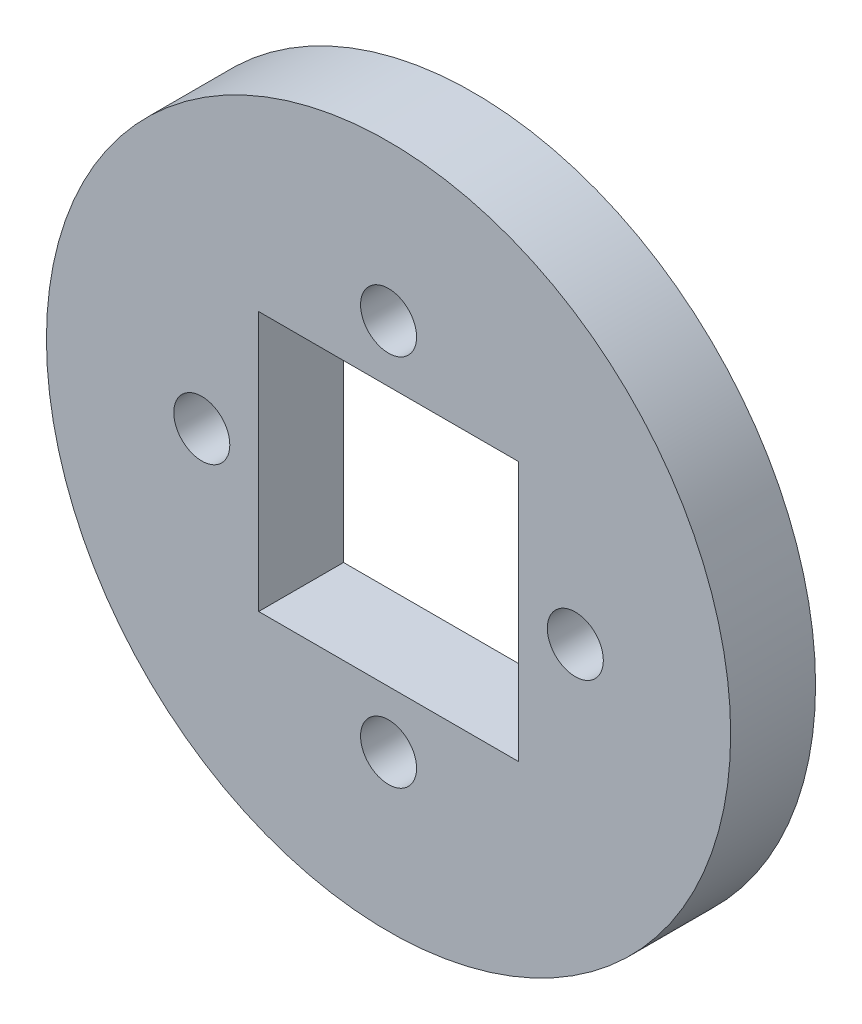
ISO-10303-21;
HEADER;
FILE_DESCRIPTION(('STEP AP214'),'2;1');
FILE_NAME('part.step','',(''),(''),'','','');
FILE_SCHEMA(('AUTOMOTIVE_DESIGN { 1 0 10303 214 1 1 1 1 }'));
ENDSEC;
DATA;
#1=APPLICATION_CONTEXT('core data for automotive mechanical design processes');
#2=APPLICATION_PROTOCOL_DEFINITION('international standard','automotive_design',2000,#1);
#3=PRODUCT_CONTEXT('',#1,'mechanical');
#4=PRODUCT('Part','Part','',(#3));
#5=PRODUCT_RELATED_PRODUCT_CATEGORY('part','',(#4));
#6=PRODUCT_DEFINITION_FORMATION('','',#4);
#7=PRODUCT_DEFINITION_CONTEXT('part definition',#1,'design');
#8=PRODUCT_DEFINITION('design','',#6,#7);
#9=PRODUCT_DEFINITION_SHAPE('','',#8);
#10=(LENGTH_UNIT() NAMED_UNIT(*) SI_UNIT(.MILLI.,.METRE.));
#11=(NAMED_UNIT(*) PLANE_ANGLE_UNIT() SI_UNIT($,.RADIAN.));
#12=(NAMED_UNIT(*) SI_UNIT($,.STERADIAN.) SOLID_ANGLE_UNIT());
#13=UNCERTAINTY_MEASURE_WITH_UNIT(LENGTH_MEASURE(1.E-05),#10,'distance_accuracy_value','');
#14=(GEOMETRIC_REPRESENTATION_CONTEXT(3) GLOBAL_UNCERTAINTY_ASSIGNED_CONTEXT((#13)) GLOBAL_UNIT_ASSIGNED_CONTEXT((#10,
#11,#12)) REPRESENTATION_CONTEXT('',''));
#15=CARTESIAN_POINT('',(0.,0.,0.));
#16=DIRECTION('',(0.,0.,1.));
#17=DIRECTION('',(1.,0.,0.));
#18=AXIS2_PLACEMENT_3D('',#15,#16,#17);
#19=CARTESIAN_POINT('',(2.28994472842277E-13,22.,10.));
#20=DIRECTION('',(0.,0.,-1.));
#21=DIRECTION('',(-1.,0.,0.));
#22=AXIS2_PLACEMENT_3D('',#19,#20,#21);
#23=CYLINDRICAL_SURFACE('',#22,1.64999999999999);
#24=CARTESIAN_POINT('',(2.28994472842277E-13,22.,0.));
#25=DIRECTION('',(0.,0.,1.));
#26=DIRECTION('',(1.,0.,0.));
#27=AXIS2_PLACEMENT_3D('',#24,#25,#26);
#28=CIRCLE('',#27,1.64999999999999);
#29=CARTESIAN_POINT('',(1.65000000000022,22.,0.));
#30=VERTEX_POINT('',#29);
#31=EDGE_CURVE('E108',#30,#30,#28,.T.);
#32=ORIENTED_EDGE('',*,*,#31,.F.);
#33=EDGE_LOOP('',(#32));
#34=FACE_BOUND('',#33,.T.);
#35=CARTESIAN_POINT('',(2.28994472842277E-13,22.,4.));
#36=DIRECTION('',(0.,0.,1.));
#37=DIRECTION('',(1.,0.,0.));
#38=AXIS2_PLACEMENT_3D('',#35,#36,#37);
#39=CIRCLE('',#38,1.64999999999999);
#40=CARTESIAN_POINT('',(1.65000000000022,22.,4.));
#41=VERTEX_POINT('',#40);
#42=EDGE_CURVE('E41',#41,#41,#39,.T.);
#43=ORIENTED_EDGE('',*,*,#42,.T.);
#44=EDGE_LOOP('',(#43));
#45=FACE_BOUND('',#44,.T.);
#46=ADVANCED_FACE('F37',(#34,#45),#23,.F.);
#47=CARTESIAN_POINT('',(22.,0.,10.));
#48=DIRECTION('',(0.,0.,-1.));
#49=DIRECTION('',(-1.,0.,0.));
#50=AXIS2_PLACEMENT_3D('',#47,#48,#49);
#51=CYLINDRICAL_SURFACE('',#50,1.64999999999998);
#52=CARTESIAN_POINT('',(22.,0.,0.));
#53=DIRECTION('',(0.,0.,1.));
#54=DIRECTION('',(1.,0.,0.));
#55=AXIS2_PLACEMENT_3D('',#52,#53,#54);
#56=CIRCLE('',#55,1.64999999999998);
#57=CARTESIAN_POINT('',(23.65,0.,0.));
#58=VERTEX_POINT('',#57);
#59=EDGE_CURVE('E140',#58,#58,#56,.T.);
#60=ORIENTED_EDGE('',*,*,#59,.F.);
#61=EDGE_LOOP('',(#60));
#62=FACE_BOUND('',#61,.T.);
#63=CARTESIAN_POINT('',(22.,0.,4.));
#64=DIRECTION('',(0.,0.,1.));
#65=DIRECTION('',(1.,0.,0.));
#66=AXIS2_PLACEMENT_3D('',#63,#64,#65);
#67=CIRCLE('',#66,1.64999999999998);
#68=CARTESIAN_POINT('',(23.65,0.,4.));
#69=VERTEX_POINT('',#68);
#70=EDGE_CURVE('E126',#69,#69,#67,.T.);
#71=ORIENTED_EDGE('',*,*,#70,.T.);
#72=EDGE_LOOP('',(#71));
#73=FACE_BOUND('',#72,.T.);
#74=ADVANCED_FACE('F154',(#62,#73),#51,.F.);
#75=CARTESIAN_POINT('',(0.,-22.,10.));
#76=DIRECTION('',(0.,0.,-1.));
#77=DIRECTION('',(-1.,0.,0.));
#78=AXIS2_PLACEMENT_3D('',#75,#76,#77);
#79=CYLINDRICAL_SURFACE('',#78,1.64999999999997);
#80=CARTESIAN_POINT('',(0.,-22.,0.));
#81=DIRECTION('',(0.,0.,1.));
#82=DIRECTION('',(1.,0.,0.));
#83=AXIS2_PLACEMENT_3D('',#80,#81,#82);
#84=CIRCLE('',#83,1.64999999999997);
#85=CARTESIAN_POINT('',(1.64999999999991,-22.,0.));
#86=VERTEX_POINT('',#85);
#87=EDGE_CURVE('E135',#86,#86,#84,.T.);
#88=ORIENTED_EDGE('',*,*,#87,.F.);
#89=EDGE_LOOP('',(#88));
#90=FACE_BOUND('',#89,.T.);
#91=CARTESIAN_POINT('',(0.,-22.,4.));
#92=DIRECTION('',(0.,0.,1.));
#93=DIRECTION('',(1.,0.,0.));
#94=AXIS2_PLACEMENT_3D('',#91,#92,#93);
#95=CIRCLE('',#94,1.64999999999997);
#96=CARTESIAN_POINT('',(1.64999999999991,-22.,4.));
#97=VERTEX_POINT('',#96);
#98=EDGE_CURVE('E123',#97,#97,#95,.T.);
#99=ORIENTED_EDGE('',*,*,#98,.T.);
#100=EDGE_LOOP('',(#99));
#101=FACE_BOUND('',#100,.T.);
#102=ADVANCED_FACE('F159',(#90,#101),#79,.F.);
#103=CARTESIAN_POINT('',(-22.,1.05330472642389E-13,10.));
#104=DIRECTION('',(0.,0.,-1.));
#105=DIRECTION('',(-1.,0.,0.));
#106=AXIS2_PLACEMENT_3D('',#103,#104,#105);
#107=CYLINDRICAL_SURFACE('',#106,1.64999999999998);
#108=CARTESIAN_POINT('',(-22.,1.05330472642389E-13,0.));
#109=DIRECTION('',(0.,0.,1.));
#110=DIRECTION('',(1.,0.,0.));
#111=AXIS2_PLACEMENT_3D('',#108,#109,#110);
#112=CIRCLE('',#111,1.64999999999998);
#113=CARTESIAN_POINT('',(-20.35,1.05330472642389E-13,0.));
#114=VERTEX_POINT('',#113);
#115=EDGE_CURVE('E131',#114,#114,#112,.T.);
#116=ORIENTED_EDGE('',*,*,#115,.F.);
#117=EDGE_LOOP('',(#116));
#118=FACE_BOUND('',#117,.T.);
#119=CARTESIAN_POINT('',(-22.,1.05330472642389E-13,4.));
#120=DIRECTION('',(0.,0.,1.));
#121=DIRECTION('',(1.,0.,0.));
#122=AXIS2_PLACEMENT_3D('',#119,#120,#121);
#123=CIRCLE('',#122,1.64999999999998);
#124=CARTESIAN_POINT('',(-20.35,1.05330472642389E-13,4.));
#125=VERTEX_POINT('',#124);
#126=EDGE_CURVE('E120',#125,#125,#123,.T.);
#127=ORIENTED_EDGE('',*,*,#126,.T.);
#128=EDGE_LOOP('',(#127));
#129=FACE_BOUND('',#128,.T.);
#130=ADVANCED_FACE('F177',(#118,#129),#107,.F.);
#131=CARTESIAN_POINT('',(-2.52575738102223E-12,3.05311331771918E-12,10.));
#132=DIRECTION('',(0.,0.,1.));
#133=DIRECTION('',(1.,0.,0.));
#134=AXIS2_PLACEMENT_3D('',#131,#132,#133);
#135=PLANE('',#134);
#136=CARTESIAN_POINT('',(22.,0.,10.));
#137=DIRECTION('',(0.,0.,1.));
#138=DIRECTION('',(1.,0.,0.));
#139=AXIS2_PLACEMENT_3D('',#136,#137,#138);
#140=CIRCLE('',#139,3.29999999999998);
#141=CARTESIAN_POINT('',(25.3,0.,10.));
#142=VERTEX_POINT('',#141);
#143=EDGE_CURVE('E394',#142,#142,#140,.T.);
#144=ORIENTED_EDGE('',*,*,#143,.F.);
#145=EDGE_LOOP('',(#144));
#146=FACE_BOUND('',#145,.T.);
#147=CARTESIAN_POINT('',(2.28994472842277E-13,22.,10.));
#148=DIRECTION('',(0.,0.,1.));
#149=DIRECTION('',(1.,0.,0.));
#150=AXIS2_PLACEMENT_3D('',#147,#148,#149);
#151=CIRCLE('',#150,3.29999999999999);
#152=CARTESIAN_POINT('',(3.30000000000022,22.,10.));
#153=VERTEX_POINT('',#152);
#154=EDGE_CURVE('E391',#153,#153,#151,.T.);
#155=ORIENTED_EDGE('',*,*,#154,.F.);
#156=EDGE_LOOP('',(#155));
#157=FACE_BOUND('',#156,.T.);
#158=CARTESIAN_POINT('',(-22.,1.05330472642389E-13,10.));
#159=DIRECTION('',(0.,0.,1.));
#160=DIRECTION('',(1.,0.,0.));
#161=AXIS2_PLACEMENT_3D('',#158,#159,#160);
#162=CIRCLE('',#161,3.29999999999998);
#163=CARTESIAN_POINT('',(-18.7,1.05330472642389E-13,10.));
#164=VERTEX_POINT('',#163);
#165=EDGE_CURVE('E381',#164,#164,#162,.T.);
#166=ORIENTED_EDGE('',*,*,#165,.F.);
#167=EDGE_LOOP('',(#166));
#168=FACE_BOUND('',#167,.T.);
#169=CARTESIAN_POINT('',(0.,-22.,10.));
#170=DIRECTION('',(0.,0.,1.));
#171=DIRECTION('',(1.,0.,0.));
#172=AXIS2_PLACEMENT_3D('',#169,#170,#171);
#173=CIRCLE('',#172,3.29999999999997);
#174=CARTESIAN_POINT('',(3.29999999999991,-22.,10.));
#175=VERTEX_POINT('',#174);
#176=EDGE_CURVE('E382',#175,#175,#173,.T.);
#177=ORIENTED_EDGE('',*,*,#176,.F.);
#178=EDGE_LOOP('',(#177));
#179=FACE_BOUND('',#178,.T.);
#180=CARTESIAN_POINT('',(-2.52575738102223E-12,3.05311331771918E-12,10.));
#181=DIRECTION('',(0.,0.,1.));
#182=DIRECTION('',(1.,0.,0.));
#183=AXIS2_PLACEMENT_3D('',#180,#181,#182);
#184=CIRCLE('',#183,40.3000000000015);
#185=CARTESIAN_POINT('',(40.299999999999,3.05311331771918E-12,10.));
#186=VERTEX_POINT('',#185);
#187=EDGE_CURVE('E11',#186,#186,#184,.T.);
#188=ORIENTED_EDGE('',*,*,#187,.T.);
#189=EDGE_LOOP('',(#188));
#190=FACE_BOUND('',#189,.T.);
#191=DIRECTION('',(0.,-1.,0.));
#192=VECTOR('',#191,1.);
#193=CARTESIAN_POINT('',(-15.3,15.3,10.));
#194=LINE('',#193,#192);
#195=CARTESIAN_POINT('',(-15.3,15.3,10.));
#196=VERTEX_POINT('',#195);
#197=CARTESIAN_POINT('',(-15.3,-15.3,10.));
#198=VERTEX_POINT('',#197);
#199=EDGE_CURVE('E88',#196,#198,#194,.T.);
#200=ORIENTED_EDGE('',*,*,#199,.F.);
#201=DIRECTION('',(-1.,0.,0.));
#202=VECTOR('',#201,1.);
#203=CARTESIAN_POINT('',(15.3,15.3,10.));
#204=LINE('',#203,#202);
#205=CARTESIAN_POINT('',(15.3,15.3,10.));
#206=VERTEX_POINT('',#205);
#207=EDGE_CURVE('E80',#206,#196,#204,.T.);
#208=ORIENTED_EDGE('',*,*,#207,.F.);
#209=DIRECTION('',(0.,1.,0.));
#210=VECTOR('',#209,1.);
#211=CARTESIAN_POINT('',(15.3,-15.3,10.));
#212=LINE('',#211,#210);
#213=CARTESIAN_POINT('',(15.3,-15.3,10.));
#214=VERTEX_POINT('',#213);
#215=EDGE_CURVE('E102',#214,#206,#212,.T.);
#216=ORIENTED_EDGE('',*,*,#215,.F.);
#217=DIRECTION('',(1.,0.,0.));
#218=VECTOR('',#217,1.);
#219=CARTESIAN_POINT('',(-15.3,-15.3,10.));
#220=LINE('',#219,#218);
#221=EDGE_CURVE('E100',#198,#214,#220,.T.);
#222=ORIENTED_EDGE('',*,*,#221,.F.);
#223=EDGE_LOOP('',(#200,#208,#216,#222));
#224=FACE_BOUND('',#223,.T.);
#225=ADVANCED_FACE('F99',(#146,#157,#168,#179,#190,#224),#135,.T.);
#226=CARTESIAN_POINT('',(-2.52575738102223E-12,3.05311331771918E-12,0.));
#227=DIRECTION('',(0.,0.,1.));
#228=DIRECTION('',(1.,0.,0.));
#229=AXIS2_PLACEMENT_3D('',#226,#227,#228);
#230=PLANE('',#229);
#231=CARTESIAN_POINT('',(-2.52575738102223E-12,3.05311331771918E-12,0.));
#232=DIRECTION('',(0.,0.,1.));
#233=DIRECTION('',(1.,0.,0.));
#234=AXIS2_PLACEMENT_3D('',#231,#232,#233);
#235=CIRCLE('',#234,40.3000000000015);
#236=CARTESIAN_POINT('',(40.299999999999,3.05311331771918E-12,0.));
#237=VERTEX_POINT('',#236);
#238=EDGE_CURVE('E46',#237,#237,#235,.T.);
#239=ORIENTED_EDGE('',*,*,#238,.F.);
#240=EDGE_LOOP('',(#239));
#241=FACE_BOUND('',#240,.T.);
#242=DIRECTION('',(-1.,0.,0.));
#243=VECTOR('',#242,1.);
#244=CARTESIAN_POINT('',(15.3,15.3,0.));
#245=LINE('',#244,#243);
#246=CARTESIAN_POINT('',(15.3,15.3,0.));
#247=VERTEX_POINT('',#246);
#248=CARTESIAN_POINT('',(-15.3,15.3,0.));
#249=VERTEX_POINT('',#248);
#250=EDGE_CURVE('E62',#247,#249,#245,.T.);
#251=ORIENTED_EDGE('',*,*,#250,.T.);
#252=DIRECTION('',(0.,-1.,0.));
#253=VECTOR('',#252,1.);
#254=CARTESIAN_POINT('',(-15.3,15.3,0.));
#255=LINE('',#254,#253);
#256=CARTESIAN_POINT('',(-15.3,-15.3,0.));
#257=VERTEX_POINT('',#256);
#258=EDGE_CURVE('E95',#249,#257,#255,.T.);
#259=ORIENTED_EDGE('',*,*,#258,.T.);
#260=DIRECTION('',(1.,0.,0.));
#261=VECTOR('',#260,1.);
#262=CARTESIAN_POINT('',(-15.3,-15.3,0.));
#263=LINE('',#262,#261);
#264=CARTESIAN_POINT('',(15.3,-15.3,0.));
#265=VERTEX_POINT('',#264);
#266=EDGE_CURVE('E110',#257,#265,#263,.T.);
#267=ORIENTED_EDGE('',*,*,#266,.T.);
#268=DIRECTION('',(0.,1.,0.));
#269=VECTOR('',#268,1.);
#270=CARTESIAN_POINT('',(15.3,-15.3,0.));
#271=LINE('',#270,#269);
#272=EDGE_CURVE('E89',#265,#247,#271,.T.);
#273=ORIENTED_EDGE('',*,*,#272,.T.);
#274=EDGE_LOOP('',(#251,#259,#267,#273));
#275=FACE_BOUND('',#274,.T.);
#276=ORIENTED_EDGE('',*,*,#31,.T.);
#277=EDGE_LOOP('',(#276));
#278=FACE_BOUND('',#277,.T.);
#279=ORIENTED_EDGE('',*,*,#59,.T.);
#280=EDGE_LOOP('',(#279));
#281=FACE_BOUND('',#280,.T.);
#282=ORIENTED_EDGE('',*,*,#87,.T.);
#283=EDGE_LOOP('',(#282));
#284=FACE_BOUND('',#283,.T.);
#285=ORIENTED_EDGE('',*,*,#115,.T.);
#286=EDGE_LOOP('',(#285));
#287=FACE_BOUND('',#286,.T.);
#288=ADVANCED_FACE('F150',(#241,#275,#278,#281,#284,#287),#230,.F.);
#289=CARTESIAN_POINT('',(-2.52575738102223E-12,3.05311331771918E-12,10.));
#290=DIRECTION('',(0.,0.,-1.));
#291=DIRECTION('',(-1.,0.,0.));
#292=AXIS2_PLACEMENT_3D('',#289,#290,#291);
#293=CYLINDRICAL_SURFACE('',#292,40.3000000000015);
#294=ORIENTED_EDGE('',*,*,#187,.F.);
#295=EDGE_LOOP('',(#294));
#296=FACE_BOUND('',#295,.T.);
#297=ORIENTED_EDGE('',*,*,#238,.T.);
#298=EDGE_LOOP('',(#297));
#299=FACE_BOUND('',#298,.T.);
#300=ADVANCED_FACE('F39',(#296,#299),#293,.T.);
#301=CARTESIAN_POINT('',(15.3,15.3,10.));
#302=DIRECTION('',(0.,-1.,0.));
#303=DIRECTION('',(1.,0.,0.));
#304=AXIS2_PLACEMENT_3D('',#301,#302,#303);
#305=PLANE('',#304);
#306=ORIENTED_EDGE('',*,*,#250,.F.);
#307=DIRECTION('',(0.,0.,-1.));
#308=VECTOR('',#307,1.);
#309=CARTESIAN_POINT('',(15.3,15.3,10.));
#310=LINE('',#309,#308);
#311=EDGE_CURVE('E84',#206,#247,#310,.T.);
#312=ORIENTED_EDGE('',*,*,#311,.F.);
#313=ORIENTED_EDGE('',*,*,#207,.T.);
#314=DIRECTION('',(0.,0.,-1.));
#315=VECTOR('',#314,1.);
#316=CARTESIAN_POINT('',(-15.3,15.3,10.));
#317=LINE('',#316,#315);
#318=EDGE_CURVE('E83',#196,#249,#317,.T.);
#319=ORIENTED_EDGE('',*,*,#318,.T.);
#320=EDGE_LOOP('',(#306,#312,#313,#319));
#321=FACE_BOUND('',#320,.T.);
#322=ADVANCED_FACE('F82',(#321),#305,.T.);
#323=CARTESIAN_POINT('',(-15.3,15.3,10.));
#324=DIRECTION('',(1.,0.,0.));
#325=DIRECTION('',(0.,1.,0.));
#326=AXIS2_PLACEMENT_3D('',#323,#324,#325);
#327=PLANE('',#326);
#328=ORIENTED_EDGE('',*,*,#258,.F.);
#329=ORIENTED_EDGE('',*,*,#318,.F.);
#330=ORIENTED_EDGE('',*,*,#199,.T.);
#331=DIRECTION('',(0.,0.,-1.));
#332=VECTOR('',#331,1.);
#333=CARTESIAN_POINT('',(-15.3,-15.3,10.));
#334=LINE('',#333,#332);
#335=EDGE_CURVE('E96',#198,#257,#334,.T.);
#336=ORIENTED_EDGE('',*,*,#335,.T.);
#337=EDGE_LOOP('',(#328,#329,#330,#336));
#338=FACE_BOUND('',#337,.T.);
#339=ADVANCED_FACE('F92',(#338),#327,.T.);
#340=CARTESIAN_POINT('',(-15.3,-15.3,10.));
#341=DIRECTION('',(0.,1.,0.));
#342=DIRECTION('',(-1.,0.,0.));
#343=AXIS2_PLACEMENT_3D('',#340,#341,#342);
#344=PLANE('',#343);
#345=ORIENTED_EDGE('',*,*,#266,.F.);
#346=ORIENTED_EDGE('',*,*,#335,.F.);
#347=ORIENTED_EDGE('',*,*,#221,.T.);
#348=DIRECTION('',(0.,0.,-1.));
#349=VECTOR('',#348,1.);
#350=CARTESIAN_POINT('',(15.3,-15.3,10.));
#351=LINE('',#350,#349);
#352=EDGE_CURVE('E54',#214,#265,#351,.T.);
#353=ORIENTED_EDGE('',*,*,#352,.T.);
#354=EDGE_LOOP('',(#345,#346,#347,#353));
#355=FACE_BOUND('',#354,.T.);
#356=ADVANCED_FACE('F168',(#355),#344,.T.);
#357=CARTESIAN_POINT('',(15.3,-15.3,10.));
#358=DIRECTION('',(-1.,0.,0.));
#359=DIRECTION('',(0.,-1.,0.));
#360=AXIS2_PLACEMENT_3D('',#357,#358,#359);
#361=PLANE('',#360);
#362=ORIENTED_EDGE('',*,*,#272,.F.);
#363=ORIENTED_EDGE('',*,*,#352,.F.);
#364=ORIENTED_EDGE('',*,*,#215,.T.);
#365=ORIENTED_EDGE('',*,*,#311,.T.);
#366=EDGE_LOOP('',(#362,#363,#364,#365));
#367=FACE_BOUND('',#366,.T.);
#368=ADVANCED_FACE('F164',(#367),#361,.T.);
#369=CARTESIAN_POINT('',(-22.,1.05330472642389E-13,4.));
#370=DIRECTION('',(0.,0.,1.));
#371=DIRECTION('',(1.,0.,0.));
#372=AXIS2_PLACEMENT_3D('',#369,#370,#371);
#373=CYLINDRICAL_SURFACE('',#372,3.29999999999998);
#374=CARTESIAN_POINT('',(-22.,1.05330472642389E-13,4.));
#375=DIRECTION('',(0.,0.,1.));
#376=DIRECTION('',(1.,0.,0.));
#377=AXIS2_PLACEMENT_3D('',#374,#375,#376);
#378=CIRCLE('',#377,3.29999999999998);
#379=CARTESIAN_POINT('',(-18.7,1.05330472642389E-13,4.));
#380=VERTEX_POINT('',#379);
#381=EDGE_CURVE('E380',#380,#380,#378,.T.);
#382=ORIENTED_EDGE('',*,*,#381,.F.);
#383=EDGE_LOOP('',(#382));
#384=FACE_BOUND('',#383,.T.);
#385=ORIENTED_EDGE('',*,*,#165,.T.);
#386=EDGE_LOOP('',(#385));
#387=FACE_BOUND('',#386,.T.);
#388=ADVANCED_FACE('F167',(#384,#387),#373,.F.);
#389=CARTESIAN_POINT('',(-22.,1.05330472642389E-13,4.));
#390=DIRECTION('',(0.,0.,1.));
#391=DIRECTION('',(1.,0.,0.));
#392=AXIS2_PLACEMENT_3D('',#389,#390,#391);
#393=PLANE('',#392);
#394=ORIENTED_EDGE('',*,*,#126,.F.);
#395=EDGE_LOOP('',(#394));
#396=FACE_BOUND('',#395,.T.);
#397=ORIENTED_EDGE('',*,*,#381,.T.);
#398=EDGE_LOOP('',(#397));
#399=FACE_BOUND('',#398,.T.);
#400=ADVANCED_FACE('F215',(#396,#399),#393,.T.);
#401=CARTESIAN_POINT('',(0.,-22.,4.));
#402=DIRECTION('',(0.,0.,1.));
#403=DIRECTION('',(1.,0.,0.));
#404=AXIS2_PLACEMENT_3D('',#401,#402,#403);
#405=CYLINDRICAL_SURFACE('',#404,3.29999999999997);
#406=CARTESIAN_POINT('',(0.,-22.,4.));
#407=DIRECTION('',(0.,0.,1.));
#408=DIRECTION('',(1.,0.,0.));
#409=AXIS2_PLACEMENT_3D('',#406,#407,#408);
#410=CIRCLE('',#409,3.29999999999997);
#411=CARTESIAN_POINT('',(3.29999999999991,-22.,4.));
#412=VERTEX_POINT('',#411);
#413=EDGE_CURVE('E143',#412,#412,#410,.T.);
#414=ORIENTED_EDGE('',*,*,#413,.F.);
#415=EDGE_LOOP('',(#414));
#416=FACE_BOUND('',#415,.T.);
#417=ORIENTED_EDGE('',*,*,#176,.T.);
#418=EDGE_LOOP('',(#417));
#419=FACE_BOUND('',#418,.T.);
#420=ADVANCED_FACE('F224',(#416,#419),#405,.F.);
#421=CARTESIAN_POINT('',(0.,-22.,4.));
#422=DIRECTION('',(0.,0.,1.));
#423=DIRECTION('',(1.,0.,0.));
#424=AXIS2_PLACEMENT_3D('',#421,#422,#423);
#425=PLANE('',#424);
#426=ORIENTED_EDGE('',*,*,#98,.F.);
#427=EDGE_LOOP('',(#426));
#428=FACE_BOUND('',#427,.T.);
#429=ORIENTED_EDGE('',*,*,#413,.T.);
#430=EDGE_LOOP('',(#429));
#431=FACE_BOUND('',#430,.T.);
#432=ADVANCED_FACE('F232',(#428,#431),#425,.T.);
#433=CARTESIAN_POINT('',(22.,0.,4.));
#434=DIRECTION('',(0.,0.,1.));
#435=DIRECTION('',(1.,0.,0.));
#436=AXIS2_PLACEMENT_3D('',#433,#434,#435);
#437=CYLINDRICAL_SURFACE('',#436,3.29999999999998);
#438=CARTESIAN_POINT('',(22.,0.,4.));
#439=DIRECTION('',(0.,0.,1.));
#440=DIRECTION('',(1.,0.,0.));
#441=AXIS2_PLACEMENT_3D('',#438,#439,#440);
#442=CIRCLE('',#441,3.29999999999998);
#443=CARTESIAN_POINT('',(25.3,0.,4.));
#444=VERTEX_POINT('',#443);
#445=EDGE_CURVE('E124',#444,#444,#442,.T.);
#446=ORIENTED_EDGE('',*,*,#445,.F.);
#447=EDGE_LOOP('',(#446));
#448=FACE_BOUND('',#447,.T.);
#449=ORIENTED_EDGE('',*,*,#143,.T.);
#450=EDGE_LOOP('',(#449));
#451=FACE_BOUND('',#450,.T.);
#452=ADVANCED_FACE('F240',(#448,#451),#437,.F.);
#453=CARTESIAN_POINT('',(22.,0.,4.));
#454=DIRECTION('',(0.,0.,1.));
#455=DIRECTION('',(1.,0.,0.));
#456=AXIS2_PLACEMENT_3D('',#453,#454,#455);
#457=PLANE('',#456);
#458=ORIENTED_EDGE('',*,*,#70,.F.);
#459=EDGE_LOOP('',(#458));
#460=FACE_BOUND('',#459,.T.);
#461=ORIENTED_EDGE('',*,*,#445,.T.);
#462=EDGE_LOOP('',(#461));
#463=FACE_BOUND('',#462,.T.);
#464=ADVANCED_FACE('F248',(#460,#463),#457,.T.);
#465=CARTESIAN_POINT('',(2.28994472842277E-13,22.,4.));
#466=DIRECTION('',(0.,0.,1.));
#467=DIRECTION('',(1.,0.,0.));
#468=AXIS2_PLACEMENT_3D('',#465,#466,#467);
#469=CYLINDRICAL_SURFACE('',#468,3.29999999999999);
#470=CARTESIAN_POINT('',(2.28994472842277E-13,22.,4.));
#471=DIRECTION('',(0.,0.,1.));
#472=DIRECTION('',(1.,0.,0.));
#473=AXIS2_PLACEMENT_3D('',#470,#471,#472);
#474=CIRCLE('',#473,3.29999999999999);
#475=CARTESIAN_POINT('',(3.30000000000022,22.,4.));
#476=VERTEX_POINT('',#475);
#477=EDGE_CURVE('E385',#476,#476,#474,.T.);
#478=ORIENTED_EDGE('',*,*,#477,.F.);
#479=EDGE_LOOP('',(#478));
#480=FACE_BOUND('',#479,.T.);
#481=ORIENTED_EDGE('',*,*,#154,.T.);
#482=EDGE_LOOP('',(#481));
#483=FACE_BOUND('',#482,.T.);
#484=ADVANCED_FACE('F256',(#480,#483),#469,.F.);
#485=CARTESIAN_POINT('',(2.28994472842277E-13,22.,4.));
#486=DIRECTION('',(0.,0.,1.));
#487=DIRECTION('',(1.,0.,0.));
#488=AXIS2_PLACEMENT_3D('',#485,#486,#487);
#489=PLANE('',#488);
#490=ORIENTED_EDGE('',*,*,#42,.F.);
#491=EDGE_LOOP('',(#490));
#492=FACE_BOUND('',#491,.T.);
#493=ORIENTED_EDGE('',*,*,#477,.T.);
#494=EDGE_LOOP('',(#493));
#495=FACE_BOUND('',#494,.T.);
#496=ADVANCED_FACE('F264',(#492,#495),#489,.T.);
#497=CLOSED_SHELL('',(#46,#74,#102,#130,#225,#288,#300,#322,#339,#356,#368,#388,#400,#420,#432,
#452,#464,#484,#496));
#498=MANIFOLD_SOLID_BREP('B2',#497);
#499=ADVANCED_BREP_SHAPE_REPRESENTATION('',(#18,#498),#14);
#500=SHAPE_DEFINITION_REPRESENTATION(#9,#499);
ENDSEC;
END-ISO-10303-21;
